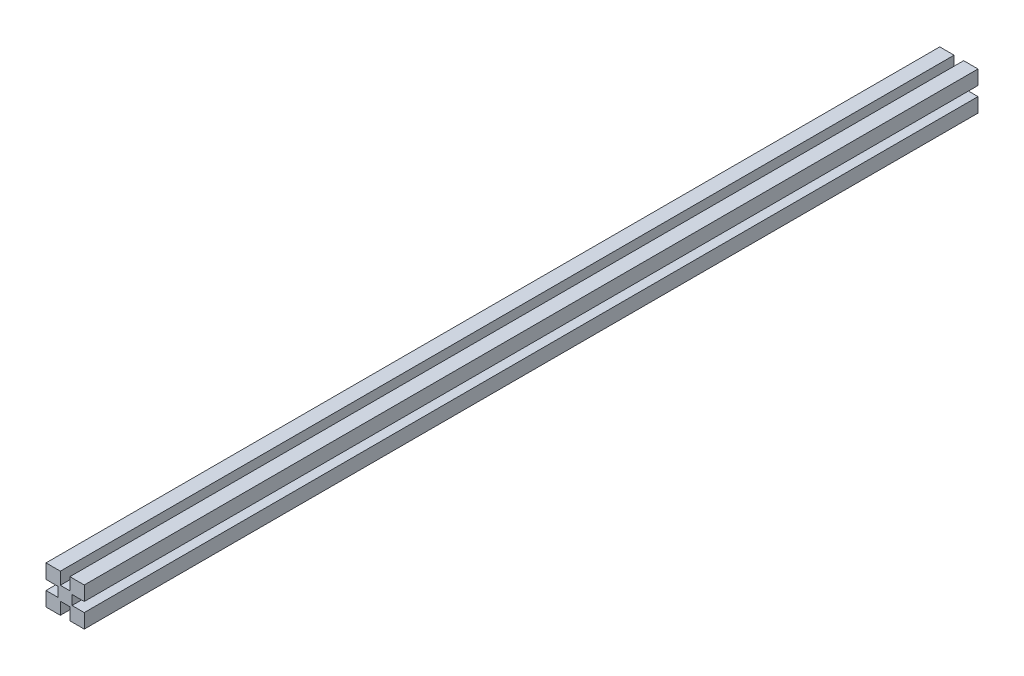
ISO-10303-21;
HEADER;
FILE_DESCRIPTION(('STEP AP214'),'2;1');
FILE_NAME('part.step','',(''),(''),'','','');
FILE_SCHEMA(('AUTOMOTIVE_DESIGN { 1 0 10303 214 1 1 1 1 }'));
ENDSEC;
DATA;
#1=APPLICATION_CONTEXT('core data for automotive mechanical design processes');
#2=APPLICATION_PROTOCOL_DEFINITION('international standard','automotive_design',2000,#1);
#3=PRODUCT_CONTEXT('',#1,'mechanical');
#4=PRODUCT('Part','Part','',(#3));
#5=PRODUCT_RELATED_PRODUCT_CATEGORY('part','',(#4));
#6=PRODUCT_DEFINITION_FORMATION('','',#4);
#7=PRODUCT_DEFINITION_CONTEXT('part definition',#1,'design');
#8=PRODUCT_DEFINITION('design','',#6,#7);
#9=PRODUCT_DEFINITION_SHAPE('','',#8);
#10=(LENGTH_UNIT() NAMED_UNIT(*) SI_UNIT(.MILLI.,.METRE.));
#11=(NAMED_UNIT(*) PLANE_ANGLE_UNIT() SI_UNIT($,.RADIAN.));
#12=(NAMED_UNIT(*) SI_UNIT($,.STERADIAN.) SOLID_ANGLE_UNIT());
#13=UNCERTAINTY_MEASURE_WITH_UNIT(LENGTH_MEASURE(1.E-05),#10,'distance_accuracy_value','');
#14=(GEOMETRIC_REPRESENTATION_CONTEXT(3) GLOBAL_UNCERTAINTY_ASSIGNED_CONTEXT((#13)) GLOBAL_UNIT_ASSIGNED_CONTEXT((#10,
#11,#12)) REPRESENTATION_CONTEXT('',''));
#15=CARTESIAN_POINT('',(0.,0.,0.));
#16=DIRECTION('',(0.,0.,1.));
#17=DIRECTION('',(1.,0.,0.));
#18=AXIS2_PLACEMENT_3D('',#15,#16,#17);
#19=CARTESIAN_POINT('',(-12.7,12.7,593.344));
#20=DIRECTION('',(0.,-1.,0.));
#21=DIRECTION('',(1.,0.,0.));
#22=AXIS2_PLACEMENT_3D('',#19,#20,#21);
#23=PLANE('',#22);
#24=DIRECTION('',(-1.,0.,0.));
#25=VECTOR('',#24,1.);
#26=CARTESIAN_POINT('',(-12.7,12.7,0.));
#27=LINE('',#26,#25);
#28=CARTESIAN_POINT('',(-3.175,12.7,0.));
#29=VERTEX_POINT('',#28);
#30=CARTESIAN_POINT('',(-12.7,12.7,0.));
#31=VERTEX_POINT('',#30);
#32=EDGE_CURVE('E212',#29,#31,#27,.T.);
#33=ORIENTED_EDGE('',*,*,#32,.T.);
#34=DIRECTION('',(0.,0.,-1.));
#35=VECTOR('',#34,1.);
#36=CARTESIAN_POINT('',(-12.7,12.7,593.344));
#37=LINE('',#36,#35);
#38=CARTESIAN_POINT('',(-12.7,12.7,593.344));
#39=VERTEX_POINT('',#38);
#40=EDGE_CURVE('E11',#39,#31,#37,.T.);
#41=ORIENTED_EDGE('',*,*,#40,.F.);
#42=DIRECTION('',(-1.,0.,0.));
#43=VECTOR('',#42,1.);
#44=CARTESIAN_POINT('',(-12.7,12.7,593.344));
#45=LINE('',#44,#43);
#46=CARTESIAN_POINT('',(-3.175,12.7,593.344));
#47=VERTEX_POINT('',#46);
#48=EDGE_CURVE('E270',#47,#39,#45,.T.);
#49=ORIENTED_EDGE('',*,*,#48,.F.);
#50=DIRECTION('',(0.,0.,-1.));
#51=VECTOR('',#50,1.);
#52=CARTESIAN_POINT('',(-3.175,12.7,593.344));
#53=LINE('',#52,#51);
#54=EDGE_CURVE('E208',#47,#29,#53,.T.);
#55=ORIENTED_EDGE('',*,*,#54,.T.);
#56=EDGE_LOOP('',(#33,#41,#49,#55));
#57=FACE_BOUND('',#56,.T.);
#58=ADVANCED_FACE('F39',(#57),#23,.F.);
#59=CARTESIAN_POINT('',(-12.7,12.7,593.344));
#60=DIRECTION('',(1.,0.,0.));
#61=DIRECTION('',(0.,0.,-1.));
#62=AXIS2_PLACEMENT_3D('',#59,#60,#61);
#63=PLANE('',#62);
#64=DIRECTION('',(0.,-1.,0.));
#65=VECTOR('',#64,1.);
#66=CARTESIAN_POINT('',(-12.7,12.7,0.));
#67=LINE('',#66,#65);
#68=CARTESIAN_POINT('',(-12.7,3.17500000000001,0.));
#69=VERTEX_POINT('',#68);
#70=EDGE_CURVE('E216',#31,#69,#67,.T.);
#71=ORIENTED_EDGE('',*,*,#70,.T.);
#72=DIRECTION('',(0.,0.,-1.));
#73=VECTOR('',#72,1.);
#74=CARTESIAN_POINT('',(-12.7,3.17500000000001,593.344));
#75=LINE('',#74,#73);
#76=CARTESIAN_POINT('',(-12.7,3.17500000000001,593.344));
#77=VERTEX_POINT('',#76);
#78=EDGE_CURVE('E48',#77,#69,#75,.T.);
#79=ORIENTED_EDGE('',*,*,#78,.F.);
#80=DIRECTION('',(0.,-1.,0.));
#81=VECTOR('',#80,1.);
#82=CARTESIAN_POINT('',(-12.7,12.7,593.344));
#83=LINE('',#82,#81);
#84=EDGE_CURVE('E135',#39,#77,#83,.T.);
#85=ORIENTED_EDGE('',*,*,#84,.F.);
#86=ORIENTED_EDGE('',*,*,#40,.T.);
#87=EDGE_LOOP('',(#71,#79,#85,#86));
#88=FACE_BOUND('',#87,.T.);
#89=ADVANCED_FACE('F420',(#88),#63,.F.);
#90=CARTESIAN_POINT('',(-12.7,3.17500000000001,593.344));
#91=DIRECTION('',(0.,1.,0.));
#92=DIRECTION('',(-1.,0.,0.));
#93=AXIS2_PLACEMENT_3D('',#90,#91,#92);
#94=PLANE('',#93);
#95=DIRECTION('',(1.,0.,0.));
#96=VECTOR('',#95,1.);
#97=CARTESIAN_POINT('',(-12.7,3.17500000000001,0.));
#98=LINE('',#97,#96);
#99=CARTESIAN_POINT('',(-4.572,3.17500000000001,0.));
#100=VERTEX_POINT('',#99);
#101=EDGE_CURVE('E219',#69,#100,#98,.T.);
#102=ORIENTED_EDGE('',*,*,#101,.T.);
#103=DIRECTION('',(0.,0.,-1.));
#104=VECTOR('',#103,1.);
#105=CARTESIAN_POINT('',(-4.572,3.17500000000001,593.344));
#106=LINE('',#105,#104);
#107=CARTESIAN_POINT('',(-4.572,3.17500000000001,593.344));
#108=VERTEX_POINT('',#107);
#109=EDGE_CURVE('E329',#108,#100,#106,.T.);
#110=ORIENTED_EDGE('',*,*,#109,.F.);
#111=DIRECTION('',(1.,0.,0.));
#112=VECTOR('',#111,1.);
#113=CARTESIAN_POINT('',(-12.7,3.17500000000001,593.344));
#114=LINE('',#113,#112);
#115=EDGE_CURVE('E339',#77,#108,#114,.T.);
#116=ORIENTED_EDGE('',*,*,#115,.F.);
#117=ORIENTED_EDGE('',*,*,#78,.T.);
#118=EDGE_LOOP('',(#102,#110,#116,#117));
#119=FACE_BOUND('',#118,.T.);
#120=ADVANCED_FACE('F337',(#119),#94,.F.);
#121=CARTESIAN_POINT('',(-4.572,3.17500000000001,593.344));
#122=DIRECTION('',(1.,0.,0.));
#123=DIRECTION('',(0.,0.,-1.));
#124=AXIS2_PLACEMENT_3D('',#121,#122,#123);
#125=PLANE('',#124);
#126=DIRECTION('',(0.,-1.,0.));
#127=VECTOR('',#126,1.);
#128=CARTESIAN_POINT('',(-4.572,3.17500000000001,0.));
#129=LINE('',#128,#127);
#130=CARTESIAN_POINT('',(-4.572,-3.17500000000001,0.));
#131=VERTEX_POINT('',#130);
#132=EDGE_CURVE('E222',#100,#131,#129,.T.);
#133=ORIENTED_EDGE('',*,*,#132,.T.);
#134=DIRECTION('',(0.,0.,-1.));
#135=VECTOR('',#134,1.);
#136=CARTESIAN_POINT('',(-4.572,-3.17500000000001,593.344));
#137=LINE('',#136,#135);
#138=CARTESIAN_POINT('',(-4.572,-3.17500000000001,593.344));
#139=VERTEX_POINT('',#138);
#140=EDGE_CURVE('E325',#139,#131,#137,.T.);
#141=ORIENTED_EDGE('',*,*,#140,.F.);
#142=DIRECTION('',(0.,-1.,0.));
#143=VECTOR('',#142,1.);
#144=CARTESIAN_POINT('',(-4.572,3.17500000000001,593.344));
#145=LINE('',#144,#143);
#146=EDGE_CURVE('E358',#108,#139,#145,.T.);
#147=ORIENTED_EDGE('',*,*,#146,.F.);
#148=ORIENTED_EDGE('',*,*,#109,.T.);
#149=EDGE_LOOP('',(#133,#141,#147,#148));
#150=FACE_BOUND('',#149,.T.);
#151=ADVANCED_FACE('F348',(#150),#125,.F.);
#152=CARTESIAN_POINT('',(-4.572,-3.17500000000001,593.344));
#153=DIRECTION('',(0.,-1.,0.));
#154=DIRECTION('',(1.,0.,0.));
#155=AXIS2_PLACEMENT_3D('',#152,#153,#154);
#156=PLANE('',#155);
#157=DIRECTION('',(-1.,0.,0.));
#158=VECTOR('',#157,1.);
#159=CARTESIAN_POINT('',(-4.572,-3.17500000000001,0.));
#160=LINE('',#159,#158);
#161=CARTESIAN_POINT('',(-12.7,-3.17500000000001,0.));
#162=VERTEX_POINT('',#161);
#163=EDGE_CURVE('E225',#131,#162,#160,.T.);
#164=ORIENTED_EDGE('',*,*,#163,.T.);
#165=DIRECTION('',(0.,0.,-1.));
#166=VECTOR('',#165,1.);
#167=CARTESIAN_POINT('',(-12.7,-3.17500000000001,593.344));
#168=LINE('',#167,#166);
#169=CARTESIAN_POINT('',(-12.7,-3.17500000000001,593.344));
#170=VERTEX_POINT('',#169);
#171=EDGE_CURVE('E321',#170,#162,#168,.T.);
#172=ORIENTED_EDGE('',*,*,#171,.F.);
#173=DIRECTION('',(-1.,0.,0.));
#174=VECTOR('',#173,1.);
#175=CARTESIAN_POINT('',(-4.572,-3.17500000000001,593.344));
#176=LINE('',#175,#174);
#177=EDGE_CURVE('E354',#139,#170,#176,.T.);
#178=ORIENTED_EDGE('',*,*,#177,.F.);
#179=ORIENTED_EDGE('',*,*,#140,.T.);
#180=EDGE_LOOP('',(#164,#172,#178,#179));
#181=FACE_BOUND('',#180,.T.);
#182=ADVANCED_FACE('F352',(#181),#156,.F.);
#183=CARTESIAN_POINT('',(-12.7,-3.17500000000001,593.344));
#184=DIRECTION('',(1.,0.,0.));
#185=DIRECTION('',(0.,0.,-1.));
#186=AXIS2_PLACEMENT_3D('',#183,#184,#185);
#187=PLANE('',#186);
#188=DIRECTION('',(0.,-1.,0.));
#189=VECTOR('',#188,1.);
#190=CARTESIAN_POINT('',(-12.7,-3.17500000000001,0.));
#191=LINE('',#190,#189);
#192=CARTESIAN_POINT('',(-12.7,-12.7,0.));
#193=VERTEX_POINT('',#192);
#194=EDGE_CURVE('E228',#162,#193,#191,.T.);
#195=ORIENTED_EDGE('',*,*,#194,.T.);
#196=DIRECTION('',(0.,0.,-1.));
#197=VECTOR('',#196,1.);
#198=CARTESIAN_POINT('',(-12.7,-12.7,593.344));
#199=LINE('',#198,#197);
#200=CARTESIAN_POINT('',(-12.7,-12.7,593.344));
#201=VERTEX_POINT('',#200);
#202=EDGE_CURVE('E317',#201,#193,#199,.T.);
#203=ORIENTED_EDGE('',*,*,#202,.F.);
#204=DIRECTION('',(0.,-1.,0.));
#205=VECTOR('',#204,1.);
#206=CARTESIAN_POINT('',(-12.7,-3.17500000000001,593.344));
#207=LINE('',#206,#205);
#208=EDGE_CURVE('E357',#170,#201,#207,.T.);
#209=ORIENTED_EDGE('',*,*,#208,.F.);
#210=ORIENTED_EDGE('',*,*,#171,.T.);
#211=EDGE_LOOP('',(#195,#203,#209,#210));
#212=FACE_BOUND('',#211,.T.);
#213=ADVANCED_FACE('F433',(#212),#187,.F.);
#214=CARTESIAN_POINT('',(-12.7,-12.7,593.344));
#215=DIRECTION('',(0.,1.,0.));
#216=DIRECTION('',(-1.,0.,0.));
#217=AXIS2_PLACEMENT_3D('',#214,#215,#216);
#218=PLANE('',#217);
#219=DIRECTION('',(1.,0.,0.));
#220=VECTOR('',#219,1.);
#221=CARTESIAN_POINT('',(-12.7,-12.7,0.));
#222=LINE('',#221,#220);
#223=CARTESIAN_POINT('',(-3.175,-12.7,0.));
#224=VERTEX_POINT('',#223);
#225=EDGE_CURVE('E231',#193,#224,#222,.T.);
#226=ORIENTED_EDGE('',*,*,#225,.T.);
#227=DIRECTION('',(0.,0.,-1.));
#228=VECTOR('',#227,1.);
#229=CARTESIAN_POINT('',(-3.175,-12.7,593.344));
#230=LINE('',#229,#228);
#231=CARTESIAN_POINT('',(-3.175,-12.7,593.344));
#232=VERTEX_POINT('',#231);
#233=EDGE_CURVE('E313',#232,#224,#230,.T.);
#234=ORIENTED_EDGE('',*,*,#233,.F.);
#235=DIRECTION('',(1.,0.,0.));
#236=VECTOR('',#235,1.);
#237=CARTESIAN_POINT('',(-12.7,-12.7,593.344));
#238=LINE('',#237,#236);
#239=EDGE_CURVE('E362',#201,#232,#238,.T.);
#240=ORIENTED_EDGE('',*,*,#239,.F.);
#241=ORIENTED_EDGE('',*,*,#202,.T.);
#242=EDGE_LOOP('',(#226,#234,#240,#241));
#243=FACE_BOUND('',#242,.T.);
#244=ADVANCED_FACE('F436',(#243),#218,.F.);
#245=CARTESIAN_POINT('',(-3.175,-12.7,593.344));
#246=DIRECTION('',(-1.,0.,0.));
#247=DIRECTION('',(0.,-1.,0.));
#248=AXIS2_PLACEMENT_3D('',#245,#246,#247);
#249=PLANE('',#248);
#250=DIRECTION('',(0.,1.,0.));
#251=VECTOR('',#250,1.);
#252=CARTESIAN_POINT('',(-3.175,-12.7,0.));
#253=LINE('',#252,#251);
#254=CARTESIAN_POINT('',(-3.175,-4.572,0.));
#255=VERTEX_POINT('',#254);
#256=EDGE_CURVE('E234',#224,#255,#253,.T.);
#257=ORIENTED_EDGE('',*,*,#256,.T.);
#258=DIRECTION('',(0.,0.,-1.));
#259=VECTOR('',#258,1.);
#260=CARTESIAN_POINT('',(-3.175,-4.572,593.344));
#261=LINE('',#260,#259);
#262=CARTESIAN_POINT('',(-3.175,-4.572,593.344));
#263=VERTEX_POINT('',#262);
#264=EDGE_CURVE('E309',#263,#255,#261,.T.);
#265=ORIENTED_EDGE('',*,*,#264,.F.);
#266=DIRECTION('',(0.,1.,0.));
#267=VECTOR('',#266,1.);
#268=CARTESIAN_POINT('',(-3.175,-12.7,593.344));
#269=LINE('',#268,#267);
#270=EDGE_CURVE('E369',#232,#263,#269,.T.);
#271=ORIENTED_EDGE('',*,*,#270,.F.);
#272=ORIENTED_EDGE('',*,*,#233,.T.);
#273=EDGE_LOOP('',(#257,#265,#271,#272));
#274=FACE_BOUND('',#273,.T.);
#275=ADVANCED_FACE('F440',(#274),#249,.F.);
#276=CARTESIAN_POINT('',(-3.175,-4.572,593.344));
#277=DIRECTION('',(0.,1.,0.));
#278=DIRECTION('',(0.,0.,1.));
#279=AXIS2_PLACEMENT_3D('',#276,#277,#278);
#280=PLANE('',#279);
#281=DIRECTION('',(1.,0.,0.));
#282=VECTOR('',#281,1.);
#283=CARTESIAN_POINT('',(-3.175,-4.572,0.));
#284=LINE('',#283,#282);
#285=CARTESIAN_POINT('',(3.175,-4.572,0.));
#286=VERTEX_POINT('',#285);
#287=EDGE_CURVE('E237',#255,#286,#284,.T.);
#288=ORIENTED_EDGE('',*,*,#287,.T.);
#289=DIRECTION('',(0.,0.,-1.));
#290=VECTOR('',#289,1.);
#291=CARTESIAN_POINT('',(3.175,-4.572,593.344));
#292=LINE('',#291,#290);
#293=CARTESIAN_POINT('',(3.175,-4.572,593.344));
#294=VERTEX_POINT('',#293);
#295=EDGE_CURVE('E305',#294,#286,#292,.T.);
#296=ORIENTED_EDGE('',*,*,#295,.F.);
#297=DIRECTION('',(1.,0.,0.));
#298=VECTOR('',#297,1.);
#299=CARTESIAN_POINT('',(-3.175,-4.572,593.344));
#300=LINE('',#299,#298);
#301=EDGE_CURVE('E372',#263,#294,#300,.T.);
#302=ORIENTED_EDGE('',*,*,#301,.F.);
#303=ORIENTED_EDGE('',*,*,#264,.T.);
#304=EDGE_LOOP('',(#288,#296,#302,#303));
#305=FACE_BOUND('',#304,.T.);
#306=ADVANCED_FACE('F444',(#305),#280,.F.);
#307=CARTESIAN_POINT('',(3.175,-4.572,593.344));
#308=DIRECTION('',(1.,0.,0.));
#309=DIRECTION('',(0.,1.,0.));
#310=AXIS2_PLACEMENT_3D('',#307,#308,#309);
#311=PLANE('',#310);
#312=DIRECTION('',(0.,-1.,0.));
#313=VECTOR('',#312,1.);
#314=CARTESIAN_POINT('',(3.175,-4.572,0.));
#315=LINE('',#314,#313);
#316=CARTESIAN_POINT('',(3.175,-12.7,0.));
#317=VERTEX_POINT('',#316);
#318=EDGE_CURVE('E240',#286,#317,#315,.T.);
#319=ORIENTED_EDGE('',*,*,#318,.T.);
#320=DIRECTION('',(0.,0.,-1.));
#321=VECTOR('',#320,1.);
#322=CARTESIAN_POINT('',(3.175,-12.7,593.344));
#323=LINE('',#322,#321);
#324=CARTESIAN_POINT('',(3.175,-12.7,593.344));
#325=VERTEX_POINT('',#324);
#326=EDGE_CURVE('E301',#325,#317,#323,.T.);
#327=ORIENTED_EDGE('',*,*,#326,.F.);
#328=DIRECTION('',(0.,-1.,0.));
#329=VECTOR('',#328,1.);
#330=CARTESIAN_POINT('',(3.175,-4.572,593.344));
#331=LINE('',#330,#329);
#332=EDGE_CURVE('E375',#294,#325,#331,.T.);
#333=ORIENTED_EDGE('',*,*,#332,.F.);
#334=ORIENTED_EDGE('',*,*,#295,.T.);
#335=EDGE_LOOP('',(#319,#327,#333,#334));
#336=FACE_BOUND('',#335,.T.);
#337=ADVANCED_FACE('F448',(#336),#311,.F.);
#338=CARTESIAN_POINT('',(3.175,-12.7,593.344));
#339=DIRECTION('',(0.,1.,0.));
#340=DIRECTION('',(-1.,0.,0.));
#341=AXIS2_PLACEMENT_3D('',#338,#339,#340);
#342=PLANE('',#341);
#343=DIRECTION('',(1.,0.,0.));
#344=VECTOR('',#343,1.);
#345=CARTESIAN_POINT('',(3.175,-12.7,0.));
#346=LINE('',#345,#344);
#347=CARTESIAN_POINT('',(12.7,-12.7,0.));
#348=VERTEX_POINT('',#347);
#349=EDGE_CURVE('E243',#317,#348,#346,.T.);
#350=ORIENTED_EDGE('',*,*,#349,.T.);
#351=DIRECTION('',(0.,0.,-1.));
#352=VECTOR('',#351,1.);
#353=CARTESIAN_POINT('',(12.7,-12.7,593.344));
#354=LINE('',#353,#352);
#355=CARTESIAN_POINT('',(12.7,-12.7,593.344));
#356=VERTEX_POINT('',#355);
#357=EDGE_CURVE('E297',#356,#348,#354,.T.);
#358=ORIENTED_EDGE('',*,*,#357,.F.);
#359=DIRECTION('',(1.,0.,0.));
#360=VECTOR('',#359,1.);
#361=CARTESIAN_POINT('',(3.175,-12.7,593.344));
#362=LINE('',#361,#360);
#363=EDGE_CURVE('E378',#325,#356,#362,.T.);
#364=ORIENTED_EDGE('',*,*,#363,.F.);
#365=ORIENTED_EDGE('',*,*,#326,.T.);
#366=EDGE_LOOP('',(#350,#358,#364,#365));
#367=FACE_BOUND('',#366,.T.);
#368=ADVANCED_FACE('F452',(#367),#342,.F.);
#369=CARTESIAN_POINT('',(12.7,-12.7,593.344));
#370=DIRECTION('',(-1.,0.,0.));
#371=DIRECTION('',(0.,0.,1.));
#372=AXIS2_PLACEMENT_3D('',#369,#370,#371);
#373=PLANE('',#372);
#374=DIRECTION('',(0.,1.,0.));
#375=VECTOR('',#374,1.);
#376=CARTESIAN_POINT('',(12.7,-12.7,0.));
#377=LINE('',#376,#375);
#378=CARTESIAN_POINT('',(12.7,-3.175,0.));
#379=VERTEX_POINT('',#378);
#380=EDGE_CURVE('E246',#348,#379,#377,.T.);
#381=ORIENTED_EDGE('',*,*,#380,.T.);
#382=DIRECTION('',(0.,0.,-1.));
#383=VECTOR('',#382,1.);
#384=CARTESIAN_POINT('',(12.7,-3.175,593.344));
#385=LINE('',#384,#383);
#386=CARTESIAN_POINT('',(12.7,-3.175,593.344));
#387=VERTEX_POINT('',#386);
#388=EDGE_CURVE('E293',#387,#379,#385,.T.);
#389=ORIENTED_EDGE('',*,*,#388,.F.);
#390=DIRECTION('',(0.,1.,0.));
#391=VECTOR('',#390,1.);
#392=CARTESIAN_POINT('',(12.7,-12.7,593.344));
#393=LINE('',#392,#391);
#394=EDGE_CURVE('E381',#356,#387,#393,.T.);
#395=ORIENTED_EDGE('',*,*,#394,.F.);
#396=ORIENTED_EDGE('',*,*,#357,.T.);
#397=EDGE_LOOP('',(#381,#389,#395,#396));
#398=FACE_BOUND('',#397,.T.);
#399=ADVANCED_FACE('F456',(#398),#373,.F.);
#400=CARTESIAN_POINT('',(12.7,-3.175,593.344));
#401=DIRECTION('',(0.,-1.,0.));
#402=DIRECTION('',(1.,0.,0.));
#403=AXIS2_PLACEMENT_3D('',#400,#401,#402);
#404=PLANE('',#403);
#405=DIRECTION('',(-1.,0.,0.));
#406=VECTOR('',#405,1.);
#407=CARTESIAN_POINT('',(12.7,-3.175,0.));
#408=LINE('',#407,#406);
#409=CARTESIAN_POINT('',(4.572,-3.175,0.));
#410=VERTEX_POINT('',#409);
#411=EDGE_CURVE('E249',#379,#410,#408,.T.);
#412=ORIENTED_EDGE('',*,*,#411,.T.);
#413=DIRECTION('',(0.,0.,-1.));
#414=VECTOR('',#413,1.);
#415=CARTESIAN_POINT('',(4.572,-3.175,593.344));
#416=LINE('',#415,#414);
#417=CARTESIAN_POINT('',(4.572,-3.175,593.344));
#418=VERTEX_POINT('',#417);
#419=EDGE_CURVE('E289',#418,#410,#416,.T.);
#420=ORIENTED_EDGE('',*,*,#419,.F.);
#421=DIRECTION('',(-1.,0.,0.));
#422=VECTOR('',#421,1.);
#423=CARTESIAN_POINT('',(12.7,-3.175,593.344));
#424=LINE('',#423,#422);
#425=EDGE_CURVE('E384',#387,#418,#424,.T.);
#426=ORIENTED_EDGE('',*,*,#425,.F.);
#427=ORIENTED_EDGE('',*,*,#388,.T.);
#428=EDGE_LOOP('',(#412,#420,#426,#427));
#429=FACE_BOUND('',#428,.T.);
#430=ADVANCED_FACE('F460',(#429),#404,.F.);
#431=CARTESIAN_POINT('',(4.572,-3.175,593.344));
#432=DIRECTION('',(-1.,0.,0.));
#433=DIRECTION('',(0.,0.,1.));
#434=AXIS2_PLACEMENT_3D('',#431,#432,#433);
#435=PLANE('',#434);
#436=DIRECTION('',(0.,1.,0.));
#437=VECTOR('',#436,1.);
#438=CARTESIAN_POINT('',(4.572,-3.175,0.));
#439=LINE('',#438,#437);
#440=CARTESIAN_POINT('',(4.572,3.175,0.));
#441=VERTEX_POINT('',#440);
#442=EDGE_CURVE('E252',#410,#441,#439,.T.);
#443=ORIENTED_EDGE('',*,*,#442,.T.);
#444=DIRECTION('',(0.,0.,-1.));
#445=VECTOR('',#444,1.);
#446=CARTESIAN_POINT('',(4.572,3.175,593.344));
#447=LINE('',#446,#445);
#448=CARTESIAN_POINT('',(4.572,3.175,593.344));
#449=VERTEX_POINT('',#448);
#450=EDGE_CURVE('E285',#449,#441,#447,.T.);
#451=ORIENTED_EDGE('',*,*,#450,.F.);
#452=DIRECTION('',(0.,1.,0.));
#453=VECTOR('',#452,1.);
#454=CARTESIAN_POINT('',(4.572,-3.175,593.344));
#455=LINE('',#454,#453);
#456=EDGE_CURVE('E387',#418,#449,#455,.T.);
#457=ORIENTED_EDGE('',*,*,#456,.F.);
#458=ORIENTED_EDGE('',*,*,#419,.T.);
#459=EDGE_LOOP('',(#443,#451,#457,#458));
#460=FACE_BOUND('',#459,.T.);
#461=ADVANCED_FACE('F464',(#460),#435,.F.);
#462=CARTESIAN_POINT('',(4.572,3.175,593.344));
#463=DIRECTION('',(0.,1.,0.));
#464=DIRECTION('',(-1.,0.,0.));
#465=AXIS2_PLACEMENT_3D('',#462,#463,#464);
#466=PLANE('',#465);
#467=DIRECTION('',(1.,0.,0.));
#468=VECTOR('',#467,1.);
#469=CARTESIAN_POINT('',(4.572,3.175,0.));
#470=LINE('',#469,#468);
#471=CARTESIAN_POINT('',(12.7,3.175,0.));
#472=VERTEX_POINT('',#471);
#473=EDGE_CURVE('E255',#441,#472,#470,.T.);
#474=ORIENTED_EDGE('',*,*,#473,.T.);
#475=DIRECTION('',(0.,0.,-1.));
#476=VECTOR('',#475,1.);
#477=CARTESIAN_POINT('',(12.7,3.175,593.344));
#478=LINE('',#477,#476);
#479=CARTESIAN_POINT('',(12.7,3.175,593.344));
#480=VERTEX_POINT('',#479);
#481=EDGE_CURVE('E281',#480,#472,#478,.T.);
#482=ORIENTED_EDGE('',*,*,#481,.F.);
#483=DIRECTION('',(1.,0.,0.));
#484=VECTOR('',#483,1.);
#485=CARTESIAN_POINT('',(4.572,3.175,593.344));
#486=LINE('',#485,#484);
#487=EDGE_CURVE('E390',#449,#480,#486,.T.);
#488=ORIENTED_EDGE('',*,*,#487,.F.);
#489=ORIENTED_EDGE('',*,*,#450,.T.);
#490=EDGE_LOOP('',(#474,#482,#488,#489));
#491=FACE_BOUND('',#490,.T.);
#492=ADVANCED_FACE('F468',(#491),#466,.F.);
#493=CARTESIAN_POINT('',(12.7,3.175,593.344));
#494=DIRECTION('',(-1.,0.,0.));
#495=DIRECTION('',(0.,0.,1.));
#496=AXIS2_PLACEMENT_3D('',#493,#494,#495);
#497=PLANE('',#496);
#498=DIRECTION('',(0.,1.,0.));
#499=VECTOR('',#498,1.);
#500=CARTESIAN_POINT('',(12.7,3.175,0.));
#501=LINE('',#500,#499);
#502=CARTESIAN_POINT('',(12.7,12.7,0.));
#503=VERTEX_POINT('',#502);
#504=EDGE_CURVE('E258',#472,#503,#501,.T.);
#505=ORIENTED_EDGE('',*,*,#504,.T.);
#506=DIRECTION('',(0.,0.,-1.));
#507=VECTOR('',#506,1.);
#508=CARTESIAN_POINT('',(12.7,12.7,593.344));
#509=LINE('',#508,#507);
#510=CARTESIAN_POINT('',(12.7,12.7,593.344));
#511=VERTEX_POINT('',#510);
#512=EDGE_CURVE('E277',#511,#503,#509,.T.);
#513=ORIENTED_EDGE('',*,*,#512,.F.);
#514=DIRECTION('',(0.,1.,0.));
#515=VECTOR('',#514,1.);
#516=CARTESIAN_POINT('',(12.7,3.175,593.344));
#517=LINE('',#516,#515);
#518=EDGE_CURVE('E393',#480,#511,#517,.T.);
#519=ORIENTED_EDGE('',*,*,#518,.F.);
#520=ORIENTED_EDGE('',*,*,#481,.T.);
#521=EDGE_LOOP('',(#505,#513,#519,#520));
#522=FACE_BOUND('',#521,.T.);
#523=ADVANCED_FACE('F401',(#522),#497,.F.);
#524=CARTESIAN_POINT('',(3.175,12.7,593.344));
#525=DIRECTION('',(0.,-1.,0.));
#526=DIRECTION('',(1.,0.,0.));
#527=AXIS2_PLACEMENT_3D('',#524,#525,#526);
#528=PLANE('',#527);
#529=DIRECTION('',(-1.,0.,0.));
#530=VECTOR('',#529,1.);
#531=CARTESIAN_POINT('',(3.175,12.7,0.));
#532=LINE('',#531,#530);
#533=CARTESIAN_POINT('',(3.175,12.7,0.));
#534=VERTEX_POINT('',#533);
#535=EDGE_CURVE('E261',#503,#534,#532,.T.);
#536=ORIENTED_EDGE('',*,*,#535,.T.);
#537=DIRECTION('',(0.,0.,-1.));
#538=VECTOR('',#537,1.);
#539=CARTESIAN_POINT('',(3.175,12.7,593.344));
#540=LINE('',#539,#538);
#541=CARTESIAN_POINT('',(3.175,12.7,593.344));
#542=VERTEX_POINT('',#541);
#543=EDGE_CURVE('E201',#542,#534,#540,.T.);
#544=ORIENTED_EDGE('',*,*,#543,.F.);
#545=DIRECTION('',(-1.,0.,0.));
#546=VECTOR('',#545,1.);
#547=CARTESIAN_POINT('',(3.175,12.7,593.344));
#548=LINE('',#547,#546);
#549=EDGE_CURVE('E190',#511,#542,#548,.T.);
#550=ORIENTED_EDGE('',*,*,#549,.F.);
#551=ORIENTED_EDGE('',*,*,#512,.T.);
#552=EDGE_LOOP('',(#536,#544,#550,#551));
#553=FACE_BOUND('',#552,.T.);
#554=ADVANCED_FACE('F405',(#553),#528,.F.);
#555=CARTESIAN_POINT('',(3.175,4.572,593.344));
#556=DIRECTION('',(1.,0.,0.));
#557=DIRECTION('',(0.,1.,0.));
#558=AXIS2_PLACEMENT_3D('',#555,#556,#557);
#559=PLANE('',#558);
#560=DIRECTION('',(0.,-1.,0.));
#561=VECTOR('',#560,1.);
#562=CARTESIAN_POINT('',(3.175,4.572,0.));
#563=LINE('',#562,#561);
#564=CARTESIAN_POINT('',(3.175,4.572,0.));
#565=VERTEX_POINT('',#564);
#566=EDGE_CURVE('E199',#534,#565,#563,.T.);
#567=ORIENTED_EDGE('',*,*,#566,.T.);
#568=DIRECTION('',(0.,0.,-1.));
#569=VECTOR('',#568,1.);
#570=CARTESIAN_POINT('',(3.175,4.572,593.344));
#571=LINE('',#570,#569);
#572=CARTESIAN_POINT('',(3.175,4.572,593.344));
#573=VERTEX_POINT('',#572);
#574=EDGE_CURVE('E196',#573,#565,#571,.T.);
#575=ORIENTED_EDGE('',*,*,#574,.F.);
#576=DIRECTION('',(0.,-1.,0.));
#577=VECTOR('',#576,1.);
#578=CARTESIAN_POINT('',(3.175,4.572,593.344));
#579=LINE('',#578,#577);
#580=EDGE_CURVE('E184',#542,#573,#579,.T.);
#581=ORIENTED_EDGE('',*,*,#580,.F.);
#582=ORIENTED_EDGE('',*,*,#543,.T.);
#583=EDGE_LOOP('',(#567,#575,#581,#582));
#584=FACE_BOUND('',#583,.T.);
#585=ADVANCED_FACE('F197',(#584),#559,.F.);
#586=CARTESIAN_POINT('',(-3.175,4.57199999999999,593.344));
#587=DIRECTION('',(0.,-1.,0.));
#588=DIRECTION('',(1.,0.,0.));
#589=AXIS2_PLACEMENT_3D('',#586,#587,#588);
#590=PLANE('',#589);
#591=DIRECTION('',(-1.,0.,0.));
#592=VECTOR('',#591,1.);
#593=CARTESIAN_POINT('',(-3.175,4.57199999999999,0.));
#594=LINE('',#593,#592);
#595=CARTESIAN_POINT('',(-3.175,4.57199999999999,0.));
#596=VERTEX_POINT('',#595);
#597=EDGE_CURVE('E121',#565,#596,#594,.T.);
#598=ORIENTED_EDGE('',*,*,#597,.T.);
#599=DIRECTION('',(0.,0.,-1.));
#600=VECTOR('',#599,1.);
#601=CARTESIAN_POINT('',(-3.175,4.57199999999999,593.344));
#602=LINE('',#601,#600);
#603=CARTESIAN_POINT('',(-3.175,4.57199999999999,593.344));
#604=VERTEX_POINT('',#603);
#605=EDGE_CURVE('E202',#604,#596,#602,.T.);
#606=ORIENTED_EDGE('',*,*,#605,.F.);
#607=DIRECTION('',(-1.,0.,0.));
#608=VECTOR('',#607,1.);
#609=CARTESIAN_POINT('',(-3.175,4.57199999999999,593.344));
#610=LINE('',#609,#608);
#611=EDGE_CURVE('E188',#573,#604,#610,.T.);
#612=ORIENTED_EDGE('',*,*,#611,.F.);
#613=ORIENTED_EDGE('',*,*,#574,.T.);
#614=EDGE_LOOP('',(#598,#606,#612,#613));
#615=FACE_BOUND('',#614,.T.);
#616=ADVANCED_FACE('F204',(#615),#590,.F.);
#617=CARTESIAN_POINT('',(-3.175,12.7,593.344));
#618=DIRECTION('',(-1.,0.,0.));
#619=DIRECTION('',(0.,-1.,0.));
#620=AXIS2_PLACEMENT_3D('',#617,#618,#619);
#621=PLANE('',#620);
#622=DIRECTION('',(0.,1.,0.));
#623=VECTOR('',#622,1.);
#624=CARTESIAN_POINT('',(-3.175,12.7,0.));
#625=LINE('',#624,#623);
#626=EDGE_CURVE('E127',#596,#29,#625,.T.);
#627=ORIENTED_EDGE('',*,*,#626,.T.);
#628=ORIENTED_EDGE('',*,*,#54,.F.);
#629=DIRECTION('',(0.,1.,0.));
#630=VECTOR('',#629,1.);
#631=CARTESIAN_POINT('',(-3.175,12.7,593.344));
#632=LINE('',#631,#630);
#633=EDGE_CURVE('E56',#604,#47,#632,.T.);
#634=ORIENTED_EDGE('',*,*,#633,.F.);
#635=ORIENTED_EDGE('',*,*,#605,.T.);
#636=EDGE_LOOP('',(#627,#628,#634,#635));
#637=FACE_BOUND('',#636,.T.);
#638=ADVANCED_FACE('F409',(#637),#621,.F.);
#639=CARTESIAN_POINT('',(0.,0.,593.344));
#640=DIRECTION('',(0.,0.,-1.));
#641=DIRECTION('',(-1.,0.,0.));
#642=AXIS2_PLACEMENT_3D('',#639,#640,#641);
#643=PLANE('',#642);
#644=ORIENTED_EDGE('',*,*,#48,.T.);
#645=ORIENTED_EDGE('',*,*,#84,.T.);
#646=ORIENTED_EDGE('',*,*,#115,.T.);
#647=ORIENTED_EDGE('',*,*,#146,.T.);
#648=ORIENTED_EDGE('',*,*,#177,.T.);
#649=ORIENTED_EDGE('',*,*,#208,.T.);
#650=ORIENTED_EDGE('',*,*,#239,.T.);
#651=ORIENTED_EDGE('',*,*,#270,.T.);
#652=ORIENTED_EDGE('',*,*,#301,.T.);
#653=ORIENTED_EDGE('',*,*,#332,.T.);
#654=ORIENTED_EDGE('',*,*,#363,.T.);
#655=ORIENTED_EDGE('',*,*,#394,.T.);
#656=ORIENTED_EDGE('',*,*,#425,.T.);
#657=ORIENTED_EDGE('',*,*,#456,.T.);
#658=ORIENTED_EDGE('',*,*,#487,.T.);
#659=ORIENTED_EDGE('',*,*,#518,.T.);
#660=ORIENTED_EDGE('',*,*,#549,.T.);
#661=ORIENTED_EDGE('',*,*,#580,.T.);
#662=ORIENTED_EDGE('',*,*,#611,.T.);
#663=ORIENTED_EDGE('',*,*,#633,.T.);
#664=EDGE_LOOP('',(#644,#645,#646,#647,#648,#649,#650,#651,#652,#653,#654,#655,#656,#657,#658,
#659,#660,#661,#662,#663));
#665=FACE_BOUND('',#664,.T.);
#666=ADVANCED_FACE('F186',(#665),#643,.F.);
#667=CARTESIAN_POINT('',(0.,0.,0.));
#668=DIRECTION('',(0.,0.,-1.));
#669=DIRECTION('',(-1.,0.,0.));
#670=AXIS2_PLACEMENT_3D('',#667,#668,#669);
#671=PLANE('',#670);
#672=ORIENTED_EDGE('',*,*,#32,.F.);
#673=ORIENTED_EDGE('',*,*,#626,.F.);
#674=ORIENTED_EDGE('',*,*,#597,.F.);
#675=ORIENTED_EDGE('',*,*,#566,.F.);
#676=ORIENTED_EDGE('',*,*,#535,.F.);
#677=ORIENTED_EDGE('',*,*,#504,.F.);
#678=ORIENTED_EDGE('',*,*,#473,.F.);
#679=ORIENTED_EDGE('',*,*,#442,.F.);
#680=ORIENTED_EDGE('',*,*,#411,.F.);
#681=ORIENTED_EDGE('',*,*,#380,.F.);
#682=ORIENTED_EDGE('',*,*,#349,.F.);
#683=ORIENTED_EDGE('',*,*,#318,.F.);
#684=ORIENTED_EDGE('',*,*,#287,.F.);
#685=ORIENTED_EDGE('',*,*,#256,.F.);
#686=ORIENTED_EDGE('',*,*,#225,.F.);
#687=ORIENTED_EDGE('',*,*,#194,.F.);
#688=ORIENTED_EDGE('',*,*,#163,.F.);
#689=ORIENTED_EDGE('',*,*,#132,.F.);
#690=ORIENTED_EDGE('',*,*,#101,.F.);
#691=ORIENTED_EDGE('',*,*,#70,.F.);
#692=EDGE_LOOP('',(#672,#673,#674,#675,#676,#677,#678,#679,#680,#681,#682,#683,#684,#685,#686,
#687,#688,#689,#690,#691));
#693=FACE_BOUND('',#692,.T.);
#694=ADVANCED_FACE('F343',(#693),#671,.T.);
#695=CLOSED_SHELL('',(#58,#89,#120,#151,#182,#213,#244,#275,#306,#337,#368,#399,#430,#461,#492,
#523,#554,#585,#616,#638,#666,#694));
#696=MANIFOLD_SOLID_BREP('B2',#695);
#697=ADVANCED_BREP_SHAPE_REPRESENTATION('',(#18,#696),#14);
#698=SHAPE_DEFINITION_REPRESENTATION(#9,#697);
ENDSEC;
END-ISO-10303-21;
